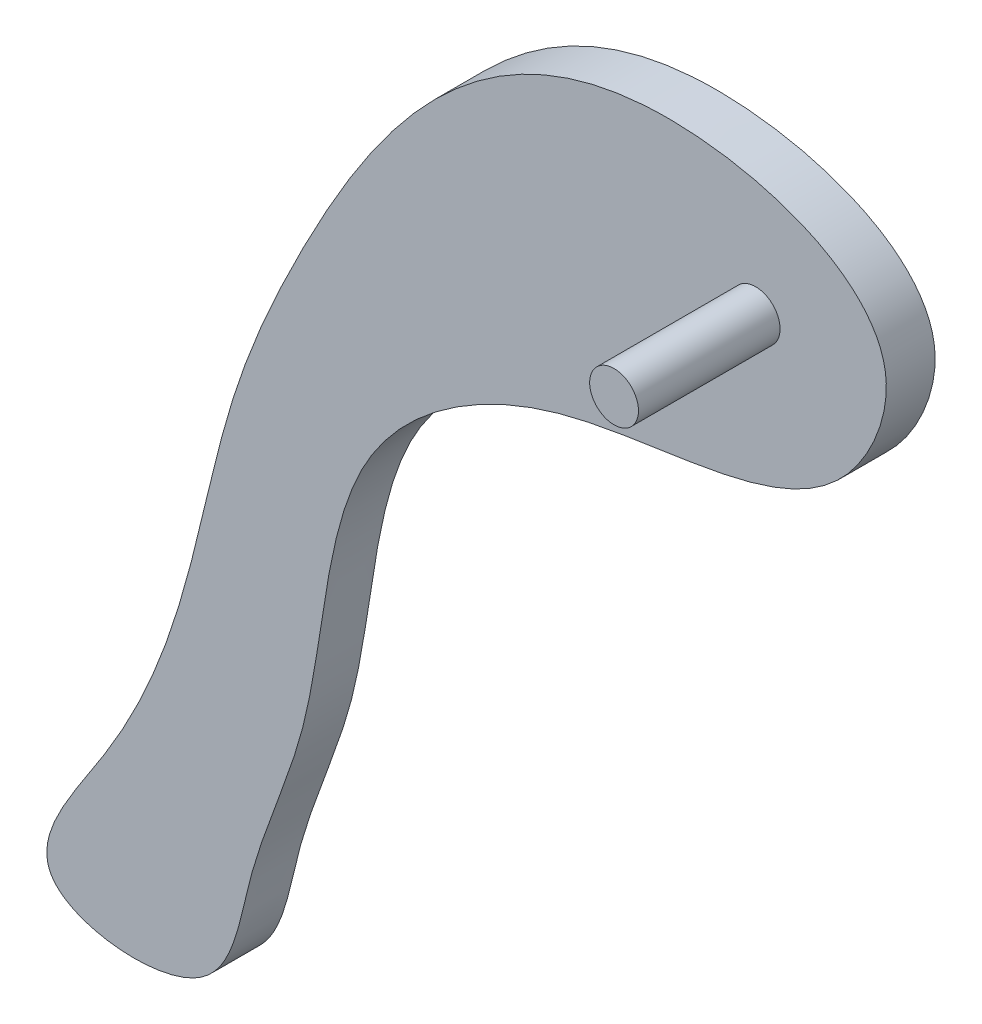
ISO-10303-21;
HEADER;
FILE_DESCRIPTION(('STEP AP214'),'2;1');
FILE_NAME('part.step','',(''),(''),'','','');
FILE_SCHEMA(('AUTOMOTIVE_DESIGN { 1 0 10303 214 1 1 1 1 }'));
ENDSEC;
DATA;
#1=APPLICATION_CONTEXT('core data for automotive mechanical design processes');
#2=APPLICATION_PROTOCOL_DEFINITION('international standard','automotive_design',2000,#1);
#3=PRODUCT_CONTEXT('',#1,'mechanical');
#4=PRODUCT('Part','Part','',(#3));
#5=PRODUCT_RELATED_PRODUCT_CATEGORY('part','',(#4));
#6=PRODUCT_DEFINITION_FORMATION('','',#4);
#7=PRODUCT_DEFINITION_CONTEXT('part definition',#1,'design');
#8=PRODUCT_DEFINITION('design','',#6,#7);
#9=PRODUCT_DEFINITION_SHAPE('','',#8);
#10=(LENGTH_UNIT() NAMED_UNIT(*) SI_UNIT(.MILLI.,.METRE.));
#11=(NAMED_UNIT(*) PLANE_ANGLE_UNIT() SI_UNIT($,.RADIAN.));
#12=(NAMED_UNIT(*) SI_UNIT($,.STERADIAN.) SOLID_ANGLE_UNIT());
#13=UNCERTAINTY_MEASURE_WITH_UNIT(LENGTH_MEASURE(1.E-05),#10,'distance_accuracy_value','');
#14=(GEOMETRIC_REPRESENTATION_CONTEXT(3) GLOBAL_UNCERTAINTY_ASSIGNED_CONTEXT((#13)) GLOBAL_UNIT_ASSIGNED_CONTEXT((#10,
#11,#12)) REPRESENTATION_CONTEXT('',''));
#15=CARTESIAN_POINT('',(0.,0.,0.));
#16=DIRECTION('',(0.,0.,1.));
#17=DIRECTION('',(1.,0.,0.));
#18=AXIS2_PLACEMENT_3D('',#15,#16,#17);
#19=CARTESIAN_POINT('',(-341.89484483176,136.96032780054,7.81505289265118));
#20=CARTESIAN_POINT('',(-342.596421541123,136.911527630408,7.81505289265118));
#21=CARTESIAN_POINT('',(-343.14139754355,136.112664619039,7.81505289265118));
#22=CARTESIAN_POINT('',(-343.720282247015,134.827967519889,7.81505289265118));
#23=CARTESIAN_POINT('',(-343.75076426671,133.954462032347,7.81505289265118));
#24=CARTESIAN_POINT('',(-344.573169226444,132.915522429103,7.81505289265118));
#25=CARTESIAN_POINT('',(-343.604211078948,132.81644314639,7.81505289265118));
#26=CARTESIAN_POINT('',(-343.518382289493,133.487285674697,7.81505289265118));
#27=CARTESIAN_POINT('',(-343.191768801997,134.144569809842,7.81505289265118));
#28=CARTESIAN_POINT('',(-343.215611140248,135.168672137011,7.81505289265118));
#29=CARTESIAN_POINT('',(-342.187690878448,135.860826144156,7.81505289265118));
#30=CARTESIAN_POINT('',(-341.133708366732,135.736482814908,7.81505289265118));
#31=CARTESIAN_POINT('',(-340.731996408955,136.768092364735,7.81505289265118));
#32=CARTESIAN_POINT('',(-341.470202488923,136.989865010512,7.81505289265118));
#33=CARTESIAN_POINT('',(-341.89484483176,136.96032780054,7.81505289265118));
#34=B_SPLINE_CURVE_WITH_KNOTS('',3,(#19,#20,#21,#22,#23,#24,#25,#26,#27,#28,#29,#30,#31,#32,
#33),.UNSPECIFIED.,.T.,.F.,(4,1,1,1,1,1,1,1,1,1,1,1,4),(0.,0.159177830000064,0.222571778534528,
0.367294655292266,0.418107249673309,0.471783736478388,0.513301840180607,0.572978205833702,
0.671765174880242,0.755128356265424,0.868017243335042,0.90365465991559,1.),.UNSPECIFIED.);
#35=DIRECTION('',(0.,0.,-1.));
#36=VECTOR('',#35,1.);
#37=SURFACE_OF_LINEAR_EXTRUSION('',#34,#36);
#38=CARTESIAN_POINT('',(-341.89484483176,136.96032780054,7.81505289265118));
#39=VERTEX_POINT('',#38);
#40=EDGE_CURVE('E42',#39,#39,#34,.T.);
#41=ORIENTED_EDGE('',*,*,#40,.F.);
#42=EDGE_LOOP('',(#41));
#43=FACE_BOUND('',#42,.T.);
#44=CARTESIAN_POINT('',(-341.89484483176,136.96032780054,7.61505289265118));
#45=CARTESIAN_POINT('',(-342.596421541123,136.911527630408,7.61505289265118));
#46=CARTESIAN_POINT('',(-343.14139754355,136.112664619039,7.61505289265118));
#47=CARTESIAN_POINT('',(-343.720282247015,134.827967519889,7.61505289265118));
#48=CARTESIAN_POINT('',(-343.75076426671,133.954462032347,7.61505289265118));
#49=CARTESIAN_POINT('',(-344.573169226444,132.915522429103,7.61505289265118));
#50=CARTESIAN_POINT('',(-343.604211078948,132.81644314639,7.61505289265118));
#51=CARTESIAN_POINT('',(-343.518382289493,133.487285674697,7.61505289265118));
#52=CARTESIAN_POINT('',(-343.191768801997,134.144569809842,7.61505289265118));
#53=CARTESIAN_POINT('',(-343.215611140248,135.168672137011,7.61505289265118));
#54=CARTESIAN_POINT('',(-342.187690878448,135.860826144156,7.61505289265118));
#55=CARTESIAN_POINT('',(-341.133708366732,135.736482814908,7.61505289265118));
#56=CARTESIAN_POINT('',(-340.731996408955,136.768092364735,7.61505289265118));
#57=CARTESIAN_POINT('',(-341.470202488923,136.989865010512,7.61505289265118));
#58=CARTESIAN_POINT('',(-341.89484483176,136.96032780054,7.61505289265118));
#59=B_SPLINE_CURVE_WITH_KNOTS('',3,(#44,#45,#46,#47,#48,#49,#50,#51,#52,#53,#54,#55,#56,#57,
#58),.UNSPECIFIED.,.T.,.F.,(4,1,1,1,1,1,1,1,1,1,1,1,4),(0.,0.159177830000064,0.222571778534528,
0.367294655292266,0.418107249673309,0.471783736478388,0.513301840180607,0.572978205833702,
0.671765174880242,0.755128356265424,0.868017243335042,0.90365465991559,1.),.UNSPECIFIED.);
#60=CARTESIAN_POINT('',(-341.89484483176,136.96032780054,7.61505289265118));
#61=VERTEX_POINT('',#60);
#62=EDGE_CURVE('E37',#61,#61,#59,.T.);
#63=ORIENTED_EDGE('',*,*,#62,.T.);
#64=EDGE_LOOP('',(#63));
#65=FACE_BOUND('',#64,.T.);
#66=ADVANCED_FACE('F33',(#43,#65),#37,.F.);
#67=CARTESIAN_POINT('',(-343.548413484972,133.233171905111,7.81505289265118));
#68=DIRECTION('',(0.,0.,-1.));
#69=DIRECTION('',(-1.,0.,0.));
#70=AXIS2_PLACEMENT_3D('',#67,#68,#69);
#71=PLANE('',#70);
#72=CARTESIAN_POINT('',(-341.434966332826,136.445427580376,7.81505289265118));
#73=DIRECTION('',(0.,0.,-1.));
#74=DIRECTION('',(-1.,0.,0.));
#75=AXIS2_PLACEMENT_3D('',#72,#73,#74);
#76=CIRCLE('',#75,0.100000000000001);
#77=CARTESIAN_POINT('',(-341.534966332826,136.445427580376,7.81505289265118));
#78=VERTEX_POINT('',#77);
#79=EDGE_CURVE('E10',#78,#78,#76,.F.);
#80=ORIENTED_EDGE('',*,*,#79,.F.);
#81=EDGE_LOOP('',(#80));
#82=FACE_BOUND('',#81,.T.);
#83=ORIENTED_EDGE('',*,*,#40,.T.);
#84=EDGE_LOOP('',(#83));
#85=FACE_BOUND('',#84,.T.);
#86=ADVANCED_FACE('F65',(#82,#85),#71,.F.);
#87=CARTESIAN_POINT('',(-343.548413484972,133.233171905111,7.61505289265118));
#88=DIRECTION('',(0.,0.,-1.));
#89=DIRECTION('',(-1.,0.,0.));
#90=AXIS2_PLACEMENT_3D('',#87,#88,#89);
#91=PLANE('',#90);
#92=ORIENTED_EDGE('',*,*,#62,.F.);
#93=EDGE_LOOP('',(#92));
#94=FACE_BOUND('',#93,.T.);
#95=ADVANCED_FACE('F62',(#94),#91,.T.);
#96=CARTESIAN_POINT('',(-341.434966332826,136.445427580376,8.39505289265118));
#97=DIRECTION('',(0.,0.,-1.));
#98=DIRECTION('',(-1.,0.,0.));
#99=AXIS2_PLACEMENT_3D('',#96,#97,#98);
#100=CYLINDRICAL_SURFACE('',#99,0.100000000000001);
#101=CARTESIAN_POINT('',(-341.434966332826,136.445427580376,8.39505289265118));
#102=DIRECTION('',(0.,0.,1.));
#103=DIRECTION('',(1.,0.,0.));
#104=AXIS2_PLACEMENT_3D('',#101,#102,#103);
#105=CIRCLE('',#104,0.100000000000001);
#106=CARTESIAN_POINT('',(-341.334966332827,136.445427580376,8.39505289265118));
#107=VERTEX_POINT('',#106);
#108=EDGE_CURVE('E48',#107,#107,#105,.T.);
#109=ORIENTED_EDGE('',*,*,#108,.F.);
#110=EDGE_LOOP('',(#109));
#111=FACE_BOUND('',#110,.T.);
#112=ORIENTED_EDGE('',*,*,#79,.T.);
#113=EDGE_LOOP('',(#112));
#114=FACE_BOUND('',#113,.T.);
#115=ADVANCED_FACE('F64',(#111,#114),#100,.T.);
#116=CARTESIAN_POINT('',(-341.434966332826,136.445427580376,8.39505289265118));
#117=DIRECTION('',(0.,0.,1.));
#118=DIRECTION('',(1.,0.,0.));
#119=AXIS2_PLACEMENT_3D('',#116,#117,#118);
#120=PLANE('',#119);
#121=ORIENTED_EDGE('',*,*,#108,.T.);
#122=EDGE_LOOP('',(#121));
#123=FACE_BOUND('',#122,.T.);
#124=ADVANCED_FACE('F71',(#123),#120,.T.);
#125=CLOSED_SHELL('',(#66,#86,#95,#115,#124));
#126=MANIFOLD_SOLID_BREP('B2',#125);
#127=ADVANCED_BREP_SHAPE_REPRESENTATION('',(#18,#126),#14);
#128=SHAPE_DEFINITION_REPRESENTATION(#9,#127);
ENDSEC;
END-ISO-10303-21;
